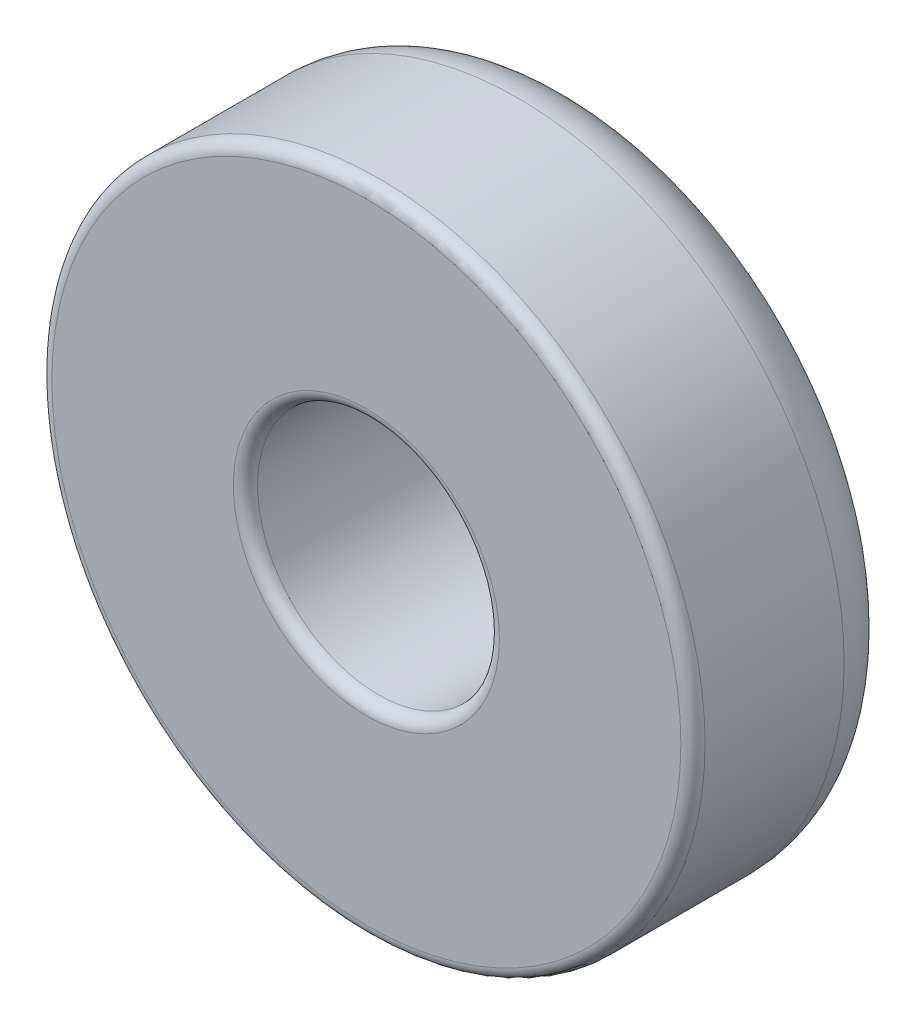
ISO-10303-21;
HEADER;
FILE_DESCRIPTION(('STEP AP214'),'2;1');
FILE_NAME('part.step','',(''),(''),'','','');
FILE_SCHEMA(('AUTOMOTIVE_DESIGN { 1 0 10303 214 1 1 1 1 }'));
ENDSEC;
DATA;
#1=APPLICATION_CONTEXT('core data for automotive mechanical design processes');
#2=APPLICATION_PROTOCOL_DEFINITION('international standard','automotive_design',2000,#1);
#3=PRODUCT_CONTEXT('',#1,'mechanical');
#4=PRODUCT('Part','Part','',(#3));
#5=PRODUCT_RELATED_PRODUCT_CATEGORY('part','',(#4));
#6=PRODUCT_DEFINITION_FORMATION('','',#4);
#7=PRODUCT_DEFINITION_CONTEXT('part definition',#1,'design');
#8=PRODUCT_DEFINITION('design','',#6,#7);
#9=PRODUCT_DEFINITION_SHAPE('','',#8);
#10=(LENGTH_UNIT() NAMED_UNIT(*) SI_UNIT(.MILLI.,.METRE.));
#11=(NAMED_UNIT(*) PLANE_ANGLE_UNIT() SI_UNIT($,.RADIAN.));
#12=(NAMED_UNIT(*) SI_UNIT($,.STERADIAN.) SOLID_ANGLE_UNIT());
#13=UNCERTAINTY_MEASURE_WITH_UNIT(LENGTH_MEASURE(1.E-05),#10,'distance_accuracy_value','');
#14=(GEOMETRIC_REPRESENTATION_CONTEXT(3) GLOBAL_UNCERTAINTY_ASSIGNED_CONTEXT((#13)) GLOBAL_UNIT_ASSIGNED_CONTEXT((#10,
#11,#12)) REPRESENTATION_CONTEXT('',''));
#15=CARTESIAN_POINT('',(0.,0.,0.));
#16=DIRECTION('',(0.,0.,1.));
#17=DIRECTION('',(1.,0.,0.));
#18=AXIS2_PLACEMENT_3D('',#15,#16,#17);
#19=CARTESIAN_POINT('',(0.,0.,1.75));
#20=DIRECTION('',(0.,0.,1.));
#21=DIRECTION('',(1.,0.,0.));
#22=AXIS2_PLACEMENT_3D('',#19,#20,#21);
#23=PLANE('',#22);
#24=CARTESIAN_POINT('',(0.,0.,1.75));
#25=DIRECTION('',(0.,0.,1.));
#26=DIRECTION('',(1.,0.,0.));
#27=AXIS2_PLACEMENT_3D('',#24,#25,#26);
#28=CIRCLE('',#27,1.1);
#29=CARTESIAN_POINT('',(1.1,0.,1.75));
#30=VERTEX_POINT('',#29);
#31=EDGE_CURVE('E48',#30,#30,#28,.F.);
#32=ORIENTED_EDGE('',*,*,#31,.T.);
#33=EDGE_LOOP('',(#32));
#34=FACE_BOUND('',#33,.T.);
#35=CARTESIAN_POINT('',(0.,0.,1.75));
#36=DIRECTION('',(0.,0.,1.));
#37=DIRECTION('',(1.,0.,0.));
#38=AXIS2_PLACEMENT_3D('',#35,#36,#37);
#39=CIRCLE('',#38,2.6);
#40=CARTESIAN_POINT('',(2.6,0.,1.75));
#41=VERTEX_POINT('',#40);
#42=EDGE_CURVE('E52',#41,#41,#39,.T.);
#43=ORIENTED_EDGE('',*,*,#42,.T.);
#44=EDGE_LOOP('',(#43));
#45=FACE_BOUND('',#44,.T.);
#46=ADVANCED_FACE('F37',(#34,#45),#23,.T.);
#47=CARTESIAN_POINT('',(0.,0.,0.));
#48=DIRECTION('',(0.,0.,1.));
#49=DIRECTION('',(1.,0.,0.));
#50=AXIS2_PLACEMENT_3D('',#47,#48,#49);
#51=PLANE('',#50);
#52=CARTESIAN_POINT('',(0.,0.,0.));
#53=DIRECTION('',(0.,0.,1.));
#54=DIRECTION('',(1.,0.,0.));
#55=AXIS2_PLACEMENT_3D('',#52,#53,#54);
#56=CIRCLE('',#55,1.1);
#57=CARTESIAN_POINT('',(1.1,0.,0.));
#58=VERTEX_POINT('',#57);
#59=EDGE_CURVE('E11',#58,#58,#56,.T.);
#60=ORIENTED_EDGE('',*,*,#59,.T.);
#61=EDGE_LOOP('',(#60));
#62=FACE_BOUND('',#61,.T.);
#63=CARTESIAN_POINT('',(0.,0.,0.));
#64=DIRECTION('',(0.,0.,1.));
#65=DIRECTION('',(1.,0.,0.));
#66=AXIS2_PLACEMENT_3D('',#63,#64,#65);
#67=CIRCLE('',#66,2.2);
#68=CARTESIAN_POINT('',(2.2,0.,0.));
#69=VERTEX_POINT('',#68);
#70=EDGE_CURVE('E63',#69,#69,#67,.F.);
#71=ORIENTED_EDGE('',*,*,#70,.T.);
#72=EDGE_LOOP('',(#71));
#73=FACE_BOUND('',#72,.T.);
#74=ADVANCED_FACE('F90',(#62,#73),#51,.F.);
#75=CARTESIAN_POINT('',(0.,0.,1.75));
#76=DIRECTION('',(0.,0.,-1.));
#77=DIRECTION('',(-1.,0.,0.));
#78=AXIS2_PLACEMENT_3D('',#75,#76,#77);
#79=CYLINDRICAL_SURFACE('',#78,2.7);
#80=CARTESIAN_POINT('',(0.,0.,1.65));
#81=DIRECTION('',(0.,0.,1.));
#82=DIRECTION('',(1.,0.,0.));
#83=AXIS2_PLACEMENT_3D('',#80,#81,#82);
#84=CIRCLE('',#83,2.7);
#85=CARTESIAN_POINT('',(2.7,0.,1.65));
#86=VERTEX_POINT('',#85);
#87=EDGE_CURVE('E44',#86,#86,#84,.F.);
#88=ORIENTED_EDGE('',*,*,#87,.T.);
#89=EDGE_LOOP('',(#88));
#90=FACE_BOUND('',#89,.T.);
#91=CARTESIAN_POINT('',(0.,0.,0.5));
#92=DIRECTION('',(0.,0.,1.));
#93=DIRECTION('',(1.,0.,0.));
#94=AXIS2_PLACEMENT_3D('',#91,#92,#93);
#95=CIRCLE('',#94,2.7);
#96=CARTESIAN_POINT('',(2.7,0.,0.5));
#97=VERTEX_POINT('',#96);
#98=EDGE_CURVE('E66',#97,#97,#95,.T.);
#99=ORIENTED_EDGE('',*,*,#98,.T.);
#100=EDGE_LOOP('',(#99));
#101=FACE_BOUND('',#100,.T.);
#102=ADVANCED_FACE('F70',(#90,#101),#79,.T.);
#103=CARTESIAN_POINT('',(0.,0.,1.75));
#104=DIRECTION('',(0.,0.,-1.));
#105=DIRECTION('',(-1.,0.,0.));
#106=AXIS2_PLACEMENT_3D('',#103,#104,#105);
#107=CYLINDRICAL_SURFACE('',#106,1.);
#108=CARTESIAN_POINT('',(0.,0.,1.65));
#109=DIRECTION('',(0.,0.,1.));
#110=DIRECTION('',(1.,0.,0.));
#111=AXIS2_PLACEMENT_3D('',#108,#109,#110);
#112=CIRCLE('',#111,1.);
#113=CARTESIAN_POINT('',(1.,0.,1.65));
#114=VERTEX_POINT('',#113);
#115=EDGE_CURVE('E57',#114,#114,#112,.T.);
#116=ORIENTED_EDGE('',*,*,#115,.T.);
#117=EDGE_LOOP('',(#116));
#118=FACE_BOUND('',#117,.T.);
#119=CARTESIAN_POINT('',(0.,0.,0.1));
#120=DIRECTION('',(0.,0.,1.));
#121=DIRECTION('',(1.,0.,0.));
#122=AXIS2_PLACEMENT_3D('',#119,#120,#121);
#123=CIRCLE('',#122,1.);
#124=CARTESIAN_POINT('',(1.,0.,0.1));
#125=VERTEX_POINT('',#124);
#126=EDGE_CURVE('E60',#125,#125,#123,.F.);
#127=ORIENTED_EDGE('',*,*,#126,.T.);
#128=EDGE_LOOP('',(#127));
#129=FACE_BOUND('',#128,.T.);
#130=ADVANCED_FACE('F75',(#118,#129),#107,.F.);
#131=CARTESIAN_POINT('',(0.,0.,0.5));
#132=DIRECTION('',(0.,0.,1.));
#133=DIRECTION('',(1.,0.,0.));
#134=AXIS2_PLACEMENT_3D('',#131,#132,#133);
#135=TOROIDAL_SURFACE('',#134,2.2,0.5);
#136=ORIENTED_EDGE('',*,*,#70,.F.);
#137=EDGE_LOOP('',(#136));
#138=FACE_BOUND('',#137,.T.);
#139=ORIENTED_EDGE('',*,*,#98,.F.);
#140=EDGE_LOOP('',(#139));
#141=FACE_BOUND('',#140,.T.);
#142=ADVANCED_FACE('F72',(#138,#141),#135,.T.);
#143=CARTESIAN_POINT('',(0.,0.,1.65));
#144=DIRECTION('',(0.,0.,1.));
#145=DIRECTION('',(1.,0.,0.));
#146=AXIS2_PLACEMENT_3D('',#143,#144,#145);
#147=TOROIDAL_SURFACE('',#146,1.1,0.1);
#148=ORIENTED_EDGE('',*,*,#31,.F.);
#149=EDGE_LOOP('',(#148));
#150=FACE_BOUND('',#149,.T.);
#151=ORIENTED_EDGE('',*,*,#115,.F.);
#152=EDGE_LOOP('',(#151));
#153=FACE_BOUND('',#152,.T.);
#154=ADVANCED_FACE('F74',(#150,#153),#147,.T.);
#155=CARTESIAN_POINT('',(0.,0.,1.65));
#156=DIRECTION('',(0.,0.,1.));
#157=DIRECTION('',(1.,0.,0.));
#158=AXIS2_PLACEMENT_3D('',#155,#156,#157);
#159=TOROIDAL_SURFACE('',#158,2.6,0.1);
#160=ORIENTED_EDGE('',*,*,#87,.F.);
#161=EDGE_LOOP('',(#160));
#162=FACE_BOUND('',#161,.T.);
#163=ORIENTED_EDGE('',*,*,#42,.F.);
#164=EDGE_LOOP('',(#163));
#165=FACE_BOUND('',#164,.T.);
#166=ADVANCED_FACE('F82',(#162,#165),#159,.T.);
#167=CARTESIAN_POINT('',(0.,0.,0.1));
#168=DIRECTION('',(0.,0.,1.));
#169=DIRECTION('',(1.,0.,0.));
#170=AXIS2_PLACEMENT_3D('',#167,#168,#169);
#171=TOROIDAL_SURFACE('',#170,1.1,0.1);
#172=ORIENTED_EDGE('',*,*,#126,.F.);
#173=EDGE_LOOP('',(#172));
#174=FACE_BOUND('',#173,.T.);
#175=ORIENTED_EDGE('',*,*,#59,.F.);
#176=EDGE_LOOP('',(#175));
#177=FACE_BOUND('',#176,.T.);
#178=ADVANCED_FACE('F39',(#174,#177),#171,.T.);
#179=CLOSED_SHELL('',(#46,#74,#102,#130,#142,#154,#166,#178));
#180=MANIFOLD_SOLID_BREP('B2',#179);
#181=ADVANCED_BREP_SHAPE_REPRESENTATION('',(#18,#180),#14);
#182=SHAPE_DEFINITION_REPRESENTATION(#9,#181);
ENDSEC;
END-ISO-10303-21;
